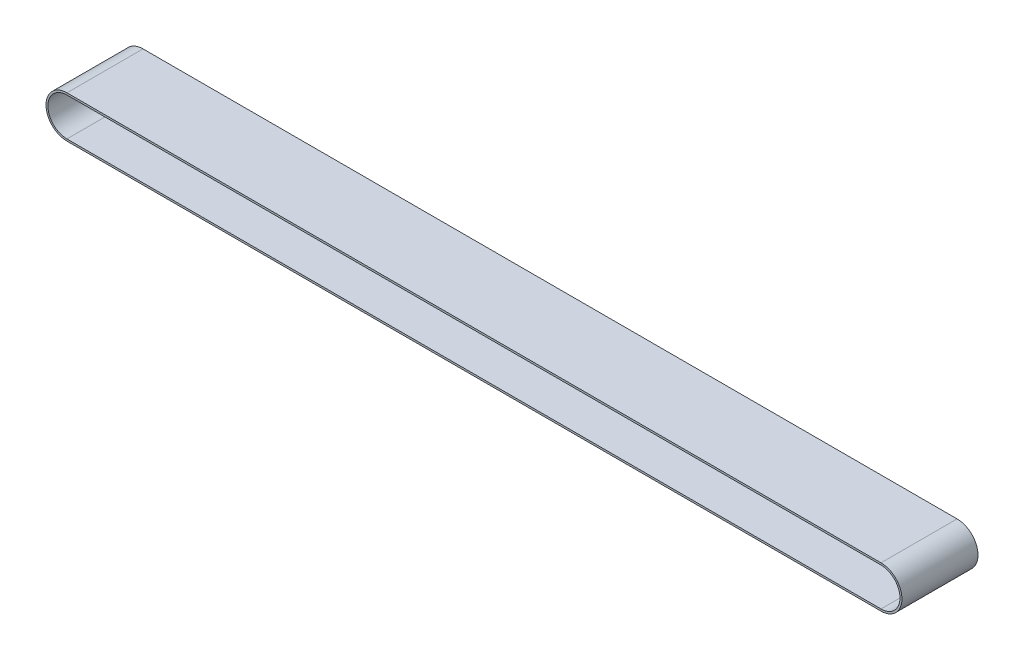
ISO-10303-21;
HEADER;
FILE_DESCRIPTION(('STEP AP214'),'2;1');
FILE_NAME('part.step','',(''),(''),'','','');
FILE_SCHEMA(('AUTOMOTIVE_DESIGN { 1 0 10303 214 1 1 1 1 }'));
ENDSEC;
DATA;
#1=APPLICATION_CONTEXT('core data for automotive mechanical design processes');
#2=APPLICATION_PROTOCOL_DEFINITION('international standard','automotive_design',2000,#1);
#3=PRODUCT_CONTEXT('',#1,'mechanical');
#4=PRODUCT('Part','Part','',(#3));
#5=PRODUCT_RELATED_PRODUCT_CATEGORY('part','',(#4));
#6=PRODUCT_DEFINITION_FORMATION('','',#4);
#7=PRODUCT_DEFINITION_CONTEXT('part definition',#1,'design');
#8=PRODUCT_DEFINITION('design','',#6,#7);
#9=PRODUCT_DEFINITION_SHAPE('','',#8);
#10=(LENGTH_UNIT() NAMED_UNIT(*) SI_UNIT(.MILLI.,.METRE.));
#11=(NAMED_UNIT(*) PLANE_ANGLE_UNIT() SI_UNIT($,.RADIAN.));
#12=(NAMED_UNIT(*) SI_UNIT($,.STERADIAN.) SOLID_ANGLE_UNIT());
#13=UNCERTAINTY_MEASURE_WITH_UNIT(LENGTH_MEASURE(1.E-05),#10,'distance_accuracy_value','');
#14=(GEOMETRIC_REPRESENTATION_CONTEXT(3) GLOBAL_UNCERTAINTY_ASSIGNED_CONTEXT((#13)) GLOBAL_UNIT_ASSIGNED_CONTEXT((#10,
#11,#12)) REPRESENTATION_CONTEXT('',''));
#15=CARTESIAN_POINT('',(0.,0.,0.));
#16=DIRECTION('',(0.,0.,1.));
#17=DIRECTION('',(1.,0.,0.));
#18=AXIS2_PLACEMENT_3D('',#15,#16,#17);
#19=CARTESIAN_POINT('',(-383.,0.,80.));
#20=DIRECTION('',(0.,0.,-1.));
#21=DIRECTION('',(-1.,0.,0.));
#22=AXIS2_PLACEMENT_3D('',#19,#20,#21);
#23=PLANE('',#22);
#24=CARTESIAN_POINT('',(-383.,0.,80.));
#25=DIRECTION('',(0.,0.,1.));
#26=DIRECTION('',(-1.,0.,0.));
#27=AXIS2_PLACEMENT_3D('',#24,#25,#26);
#28=CIRCLE('',#27,22.);
#29=CARTESIAN_POINT('',(-383.,22.,80.));
#30=VERTEX_POINT('',#29);
#31=CARTESIAN_POINT('',(-383.,-22.,80.));
#32=VERTEX_POINT('',#31);
#33=EDGE_CURVE('E138',#30,#32,#28,.T.);
#34=ORIENTED_EDGE('',*,*,#33,.T.);
#35=DIRECTION('',(1.,0.,0.));
#36=VECTOR('',#35,1.);
#37=CARTESIAN_POINT('',(473.,-21.9999999999999,80.));
#38=LINE('',#37,#36);
#39=CARTESIAN_POINT('',(473.,-21.9999999999998,80.));
#40=VERTEX_POINT('',#39);
#41=EDGE_CURVE('E141',#32,#40,#38,.T.);
#42=ORIENTED_EDGE('',*,*,#41,.T.);
#43=CARTESIAN_POINT('',(473.,0.,80.));
#44=DIRECTION('',(0.,0.,1.));
#45=DIRECTION('',(-1.,0.,0.));
#46=AXIS2_PLACEMENT_3D('',#43,#44,#45);
#47=CIRCLE('',#46,21.9999999999999);
#48=CARTESIAN_POINT('',(473.,22.,80.));
#49=VERTEX_POINT('',#48);
#50=EDGE_CURVE('E144',#40,#49,#47,.T.);
#51=ORIENTED_EDGE('',*,*,#50,.T.);
#52=DIRECTION('',(-1.,0.,0.));
#53=VECTOR('',#52,1.);
#54=CARTESIAN_POINT('',(-383.,22.,80.));
#55=LINE('',#54,#53);
#56=EDGE_CURVE('E146',#49,#30,#55,.T.);
#57=ORIENTED_EDGE('',*,*,#56,.T.);
#58=EDGE_LOOP('',(#34,#42,#51,#57));
#59=FACE_BOUND('',#58,.T.);
#60=CARTESIAN_POINT('',(-383.,0.,80.));
#61=DIRECTION('',(0.,0.,1.));
#62=DIRECTION('',(-1.,0.,0.));
#63=AXIS2_PLACEMENT_3D('',#60,#61,#62);
#64=CIRCLE('',#63,20.);
#65=CARTESIAN_POINT('',(-383.,20.,80.));
#66=VERTEX_POINT('',#65);
#67=CARTESIAN_POINT('',(-383.,-20.,80.));
#68=VERTEX_POINT('',#67);
#69=EDGE_CURVE('E102',#66,#68,#64,.T.);
#70=ORIENTED_EDGE('',*,*,#69,.F.);
#71=DIRECTION('',(-1.,0.,0.));
#72=VECTOR('',#71,1.);
#73=CARTESIAN_POINT('',(-383.,20.,80.));
#74=LINE('',#73,#72);
#75=CARTESIAN_POINT('',(473.,20.,80.));
#76=VERTEX_POINT('',#75);
#77=EDGE_CURVE('E124',#76,#66,#74,.T.);
#78=ORIENTED_EDGE('',*,*,#77,.F.);
#79=CARTESIAN_POINT('',(473.,0.,80.));
#80=DIRECTION('',(0.,0.,1.));
#81=DIRECTION('',(1.,0.,0.));
#82=AXIS2_PLACEMENT_3D('',#79,#80,#81);
#83=CIRCLE('',#82,20.);
#84=CARTESIAN_POINT('',(473.,-20.,80.));
#85=VERTEX_POINT('',#84);
#86=EDGE_CURVE('E122',#85,#76,#83,.T.);
#87=ORIENTED_EDGE('',*,*,#86,.F.);
#88=DIRECTION('',(1.,0.,0.));
#89=VECTOR('',#88,1.);
#90=CARTESIAN_POINT('',(-383.,-20.,80.));
#91=LINE('',#90,#89);
#92=EDGE_CURVE('E110',#68,#85,#91,.T.);
#93=ORIENTED_EDGE('',*,*,#92,.F.);
#94=EDGE_LOOP('',(#70,#78,#87,#93));
#95=FACE_BOUND('',#94,.T.);
#96=ADVANCED_FACE('F37',(#59,#95),#23,.F.);
#97=CARTESIAN_POINT('',(-383.,0.,0.));
#98=DIRECTION('',(0.,0.,-1.));
#99=DIRECTION('',(-1.,0.,0.));
#100=AXIS2_PLACEMENT_3D('',#97,#98,#99);
#101=PLANE('',#100);
#102=CARTESIAN_POINT('',(-383.,0.,0.));
#103=DIRECTION('',(0.,0.,1.));
#104=DIRECTION('',(-1.,0.,0.));
#105=AXIS2_PLACEMENT_3D('',#102,#103,#104);
#106=CIRCLE('',#105,22.);
#107=CARTESIAN_POINT('',(-383.,22.,0.));
#108=VERTEX_POINT('',#107);
#109=CARTESIAN_POINT('',(-383.,-22.,0.));
#110=VERTEX_POINT('',#109);
#111=EDGE_CURVE('E118',#108,#110,#106,.T.);
#112=ORIENTED_EDGE('',*,*,#111,.F.);
#113=DIRECTION('',(-1.,0.,0.));
#114=VECTOR('',#113,1.);
#115=CARTESIAN_POINT('',(-383.,22.,0.));
#116=LINE('',#115,#114);
#117=CARTESIAN_POINT('',(473.,22.,0.));
#118=VERTEX_POINT('',#117);
#119=EDGE_CURVE('E142',#118,#108,#116,.T.);
#120=ORIENTED_EDGE('',*,*,#119,.F.);
#121=CARTESIAN_POINT('',(473.,0.,0.));
#122=DIRECTION('',(0.,0.,1.));
#123=DIRECTION('',(-1.,0.,0.));
#124=AXIS2_PLACEMENT_3D('',#121,#122,#123);
#125=CIRCLE('',#124,21.9999999999999);
#126=CARTESIAN_POINT('',(473.,-21.9999999999998,0.));
#127=VERTEX_POINT('',#126);
#128=EDGE_CURVE('E153',#127,#118,#125,.T.);
#129=ORIENTED_EDGE('',*,*,#128,.F.);
#130=DIRECTION('',(1.,0.,0.));
#131=VECTOR('',#130,1.);
#132=CARTESIAN_POINT('',(473.,-21.9999999999999,0.));
#133=LINE('',#132,#131);
#134=EDGE_CURVE('E151',#110,#127,#133,.T.);
#135=ORIENTED_EDGE('',*,*,#134,.F.);
#136=EDGE_LOOP('',(#112,#120,#129,#135));
#137=FACE_BOUND('',#136,.T.);
#138=DIRECTION('',(-1.,0.,0.));
#139=VECTOR('',#138,1.);
#140=CARTESIAN_POINT('',(-383.,20.,0.));
#141=LINE('',#140,#139);
#142=CARTESIAN_POINT('',(473.,20.,0.));
#143=VERTEX_POINT('',#142);
#144=CARTESIAN_POINT('',(-383.,20.,0.));
#145=VERTEX_POINT('',#144);
#146=EDGE_CURVE('E111',#143,#145,#141,.T.);
#147=ORIENTED_EDGE('',*,*,#146,.T.);
#148=CARTESIAN_POINT('',(-383.,0.,0.));
#149=DIRECTION('',(0.,0.,1.));
#150=DIRECTION('',(-1.,0.,0.));
#151=AXIS2_PLACEMENT_3D('',#148,#149,#150);
#152=CIRCLE('',#151,20.);
#153=CARTESIAN_POINT('',(-383.,-20.,0.));
#154=VERTEX_POINT('',#153);
#155=EDGE_CURVE('E60',#145,#154,#152,.T.);
#156=ORIENTED_EDGE('',*,*,#155,.T.);
#157=DIRECTION('',(1.,0.,0.));
#158=VECTOR('',#157,1.);
#159=CARTESIAN_POINT('',(-383.,-20.,0.));
#160=LINE('',#159,#158);
#161=CARTESIAN_POINT('',(473.,-20.,0.));
#162=VERTEX_POINT('',#161);
#163=EDGE_CURVE('E117',#154,#162,#160,.T.);
#164=ORIENTED_EDGE('',*,*,#163,.T.);
#165=CARTESIAN_POINT('',(473.,0.,0.));
#166=DIRECTION('',(0.,0.,1.));
#167=DIRECTION('',(1.,0.,0.));
#168=AXIS2_PLACEMENT_3D('',#165,#166,#167);
#169=CIRCLE('',#168,20.);
#170=EDGE_CURVE('E130',#162,#143,#169,.T.);
#171=ORIENTED_EDGE('',*,*,#170,.T.);
#172=EDGE_LOOP('',(#147,#156,#164,#171));
#173=FACE_BOUND('',#172,.T.);
#174=ADVANCED_FACE('F171',(#137,#173),#101,.T.);
#175=CARTESIAN_POINT('',(-383.,0.,80.));
#176=DIRECTION('',(0.,0.,-1.));
#177=DIRECTION('',(-1.,0.,0.));
#178=AXIS2_PLACEMENT_3D('',#175,#176,#177);
#179=CYLINDRICAL_SURFACE('',#178,22.);
#180=ORIENTED_EDGE('',*,*,#111,.T.);
#181=DIRECTION('',(0.,0.,-1.));
#182=VECTOR('',#181,1.);
#183=CARTESIAN_POINT('',(-383.,-22.,80.));
#184=LINE('',#183,#182);
#185=EDGE_CURVE('E11',#32,#110,#184,.T.);
#186=ORIENTED_EDGE('',*,*,#185,.F.);
#187=ORIENTED_EDGE('',*,*,#33,.F.);
#188=DIRECTION('',(0.,0.,-1.));
#189=VECTOR('',#188,1.);
#190=CARTESIAN_POINT('',(-383.,22.,80.));
#191=LINE('',#190,#189);
#192=EDGE_CURVE('E148',#30,#108,#191,.T.);
#193=ORIENTED_EDGE('',*,*,#192,.T.);
#194=EDGE_LOOP('',(#180,#186,#187,#193));
#195=FACE_BOUND('',#194,.T.);
#196=ADVANCED_FACE('F39',(#195),#179,.T.);
#197=CARTESIAN_POINT('',(473.,-21.9999999999999,80.));
#198=DIRECTION('',(0.,1.,0.));
#199=DIRECTION('',(-1.,0.,0.));
#200=AXIS2_PLACEMENT_3D('',#197,#198,#199);
#201=PLANE('',#200);
#202=ORIENTED_EDGE('',*,*,#134,.T.);
#203=DIRECTION('',(0.,0.,-1.));
#204=VECTOR('',#203,1.);
#205=CARTESIAN_POINT('',(473.,-21.9999999999998,80.));
#206=LINE('',#205,#204);
#207=EDGE_CURVE('E45',#40,#127,#206,.T.);
#208=ORIENTED_EDGE('',*,*,#207,.F.);
#209=ORIENTED_EDGE('',*,*,#41,.F.);
#210=ORIENTED_EDGE('',*,*,#185,.T.);
#211=EDGE_LOOP('',(#202,#208,#209,#210));
#212=FACE_BOUND('',#211,.T.);
#213=ADVANCED_FACE('F181',(#212),#201,.F.);
#214=CARTESIAN_POINT('',(473.,0.,80.));
#215=DIRECTION('',(0.,0.,-1.));
#216=DIRECTION('',(-1.,0.,0.));
#217=AXIS2_PLACEMENT_3D('',#214,#215,#216);
#218=CYLINDRICAL_SURFACE('',#217,21.9999999999999);
#219=ORIENTED_EDGE('',*,*,#128,.T.);
#220=DIRECTION('',(0.,0.,-1.));
#221=VECTOR('',#220,1.);
#222=CARTESIAN_POINT('',(473.,22.,80.));
#223=LINE('',#222,#221);
#224=EDGE_CURVE('E158',#49,#118,#223,.T.);
#225=ORIENTED_EDGE('',*,*,#224,.F.);
#226=ORIENTED_EDGE('',*,*,#50,.F.);
#227=ORIENTED_EDGE('',*,*,#207,.T.);
#228=EDGE_LOOP('',(#219,#225,#226,#227));
#229=FACE_BOUND('',#228,.T.);
#230=ADVANCED_FACE('F165',(#229),#218,.T.);
#231=CARTESIAN_POINT('',(-383.,22.,80.));
#232=DIRECTION('',(0.,-1.,0.));
#233=DIRECTION('',(0.,0.,-1.));
#234=AXIS2_PLACEMENT_3D('',#231,#232,#233);
#235=PLANE('',#234);
#236=ORIENTED_EDGE('',*,*,#119,.T.);
#237=ORIENTED_EDGE('',*,*,#192,.F.);
#238=ORIENTED_EDGE('',*,*,#56,.F.);
#239=ORIENTED_EDGE('',*,*,#224,.T.);
#240=EDGE_LOOP('',(#236,#237,#238,#239));
#241=FACE_BOUND('',#240,.T.);
#242=ADVANCED_FACE('F175',(#241),#235,.F.);
#243=CARTESIAN_POINT('',(-383.,0.,80.));
#244=DIRECTION('',(0.,0.,-1.));
#245=DIRECTION('',(-1.,0.,0.));
#246=AXIS2_PLACEMENT_3D('',#243,#244,#245);
#247=CYLINDRICAL_SURFACE('',#246,20.);
#248=ORIENTED_EDGE('',*,*,#155,.F.);
#249=DIRECTION('',(0.,0.,-1.));
#250=VECTOR('',#249,1.);
#251=CARTESIAN_POINT('',(-383.,20.,80.));
#252=LINE('',#251,#250);
#253=EDGE_CURVE('E106',#66,#145,#252,.T.);
#254=ORIENTED_EDGE('',*,*,#253,.F.);
#255=ORIENTED_EDGE('',*,*,#69,.T.);
#256=DIRECTION('',(0.,0.,-1.));
#257=VECTOR('',#256,1.);
#258=CARTESIAN_POINT('',(-383.,-20.,80.));
#259=LINE('',#258,#257);
#260=EDGE_CURVE('E105',#68,#154,#259,.T.);
#261=ORIENTED_EDGE('',*,*,#260,.T.);
#262=EDGE_LOOP('',(#248,#254,#255,#261));
#263=FACE_BOUND('',#262,.T.);
#264=ADVANCED_FACE('F104',(#263),#247,.F.);
#265=CARTESIAN_POINT('',(-383.,-20.,80.));
#266=DIRECTION('',(0.,1.,0.));
#267=DIRECTION('',(0.,0.,1.));
#268=AXIS2_PLACEMENT_3D('',#265,#266,#267);
#269=PLANE('',#268);
#270=ORIENTED_EDGE('',*,*,#163,.F.);
#271=ORIENTED_EDGE('',*,*,#260,.F.);
#272=ORIENTED_EDGE('',*,*,#92,.T.);
#273=DIRECTION('',(0.,0.,-1.));
#274=VECTOR('',#273,1.);
#275=CARTESIAN_POINT('',(473.,-20.,80.));
#276=LINE('',#275,#274);
#277=EDGE_CURVE('E119',#85,#162,#276,.T.);
#278=ORIENTED_EDGE('',*,*,#277,.T.);
#279=EDGE_LOOP('',(#270,#271,#272,#278));
#280=FACE_BOUND('',#279,.T.);
#281=ADVANCED_FACE('F114',(#280),#269,.T.);
#282=CARTESIAN_POINT('',(473.,0.,80.));
#283=DIRECTION('',(0.,0.,-1.));
#284=DIRECTION('',(-1.,0.,0.));
#285=AXIS2_PLACEMENT_3D('',#282,#283,#284);
#286=CYLINDRICAL_SURFACE('',#285,20.);
#287=ORIENTED_EDGE('',*,*,#170,.F.);
#288=ORIENTED_EDGE('',*,*,#277,.F.);
#289=ORIENTED_EDGE('',*,*,#86,.T.);
#290=DIRECTION('',(0.,0.,-1.));
#291=VECTOR('',#290,1.);
#292=CARTESIAN_POINT('',(473.,20.,80.));
#293=LINE('',#292,#291);
#294=EDGE_CURVE('E52',#76,#143,#293,.T.);
#295=ORIENTED_EDGE('',*,*,#294,.T.);
#296=EDGE_LOOP('',(#287,#288,#289,#295));
#297=FACE_BOUND('',#296,.T.);
#298=ADVANCED_FACE('F204',(#297),#286,.F.);
#299=CARTESIAN_POINT('',(-383.,20.,80.));
#300=DIRECTION('',(0.,-1.,0.));
#301=DIRECTION('',(0.,0.,-1.));
#302=AXIS2_PLACEMENT_3D('',#299,#300,#301);
#303=PLANE('',#302);
#304=ORIENTED_EDGE('',*,*,#146,.F.);
#305=ORIENTED_EDGE('',*,*,#294,.F.);
#306=ORIENTED_EDGE('',*,*,#77,.T.);
#307=ORIENTED_EDGE('',*,*,#253,.T.);
#308=EDGE_LOOP('',(#304,#305,#306,#307));
#309=FACE_BOUND('',#308,.T.);
#310=ADVANCED_FACE('F208',(#309),#303,.T.);
#311=CLOSED_SHELL('',(#96,#174,#196,#213,#230,#242,#264,#281,#298,#310));
#312=MANIFOLD_SOLID_BREP('B2',#311);
#313=ADVANCED_BREP_SHAPE_REPRESENTATION('',(#18,#312),#14);
#314=SHAPE_DEFINITION_REPRESENTATION(#9,#313);
ENDSEC;
END-ISO-10303-21;
